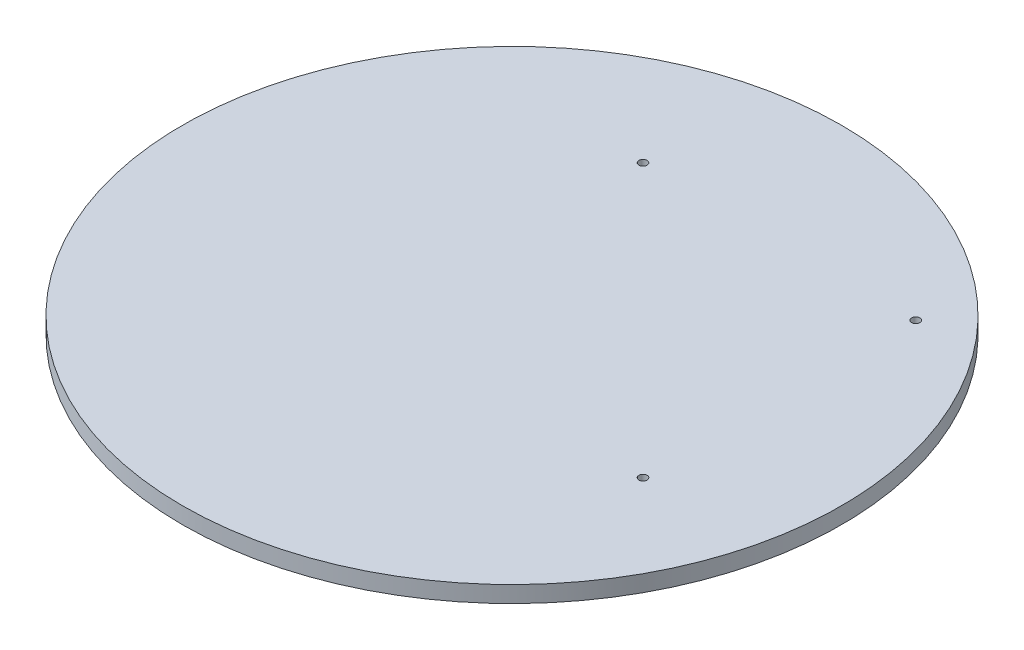
ISO-10303-21;
HEADER;
FILE_DESCRIPTION(('STEP AP214'),'2;1');
FILE_NAME('part.step','',(''),(''),'','','');
FILE_SCHEMA(('AUTOMOTIVE_DESIGN { 1 0 10303 214 1 1 1 1 }'));
ENDSEC;
DATA;
#1=APPLICATION_CONTEXT('core data for automotive mechanical design processes');
#2=APPLICATION_PROTOCOL_DEFINITION('international standard','automotive_design',2000,#1);
#3=PRODUCT_CONTEXT('',#1,'mechanical');
#4=PRODUCT('Part','Part','',(#3));
#5=PRODUCT_RELATED_PRODUCT_CATEGORY('part','',(#4));
#6=PRODUCT_DEFINITION_FORMATION('','',#4);
#7=PRODUCT_DEFINITION_CONTEXT('part definition',#1,'design');
#8=PRODUCT_DEFINITION('design','',#6,#7);
#9=PRODUCT_DEFINITION_SHAPE('','',#8);
#10=(LENGTH_UNIT() NAMED_UNIT(*) SI_UNIT(.MILLI.,.METRE.));
#11=(NAMED_UNIT(*) PLANE_ANGLE_UNIT() SI_UNIT($,.RADIAN.));
#12=(NAMED_UNIT(*) SI_UNIT($,.STERADIAN.) SOLID_ANGLE_UNIT());
#13=UNCERTAINTY_MEASURE_WITH_UNIT(LENGTH_MEASURE(1.E-05),#10,'distance_accuracy_value','');
#14=(GEOMETRIC_REPRESENTATION_CONTEXT(3) GLOBAL_UNCERTAINTY_ASSIGNED_CONTEXT((#13)) GLOBAL_UNIT_ASSIGNED_CONTEXT((#10,
#11,#12)) REPRESENTATION_CONTEXT('',''));
#15=CARTESIAN_POINT('',(0.,0.,0.));
#16=DIRECTION('',(0.,0.,1.));
#17=DIRECTION('',(1.,0.,0.));
#18=AXIS2_PLACEMENT_3D('',#15,#16,#17);
#19=CARTESIAN_POINT('',(0.,10.,0.));
#20=DIRECTION('',(0.,1.,0.));
#21=DIRECTION('',(0.,0.,1.));
#22=AXIS2_PLACEMENT_3D('',#19,#20,#21);
#23=PLANE('',#22);
#24=CARTESIAN_POINT('',(125.,10.,-120.));
#25=DIRECTION('',(0.,1.,0.));
#26=DIRECTION('',(0.,0.,1.));
#27=AXIS2_PLACEMENT_3D('',#24,#25,#26);
#28=CIRCLE('',#27,2.49999999999997);
#29=CARTESIAN_POINT('',(125.,10.,-117.5));
#30=VERTEX_POINT('',#29);
#31=EDGE_CURVE('E78',#30,#30,#28,.T.);
#32=ORIENTED_EDGE('',*,*,#31,.F.);
#33=EDGE_LOOP('',(#32));
#34=FACE_BOUND('',#33,.T.);
#35=CARTESIAN_POINT('',(0.,10.,0.));
#36=DIRECTION('',(0.,1.,0.));
#37=DIRECTION('',(0.,0.,1.));
#38=AXIS2_PLACEMENT_3D('',#35,#36,#37);
#39=CIRCLE('',#38,200.);
#40=CARTESIAN_POINT('',(0.,10.,200.));
#41=VERTEX_POINT('',#40);
#42=EDGE_CURVE('E11',#41,#41,#39,.T.);
#43=ORIENTED_EDGE('',*,*,#42,.T.);
#44=EDGE_LOOP('',(#43));
#45=FACE_BOUND('',#44,.T.);
#46=CARTESIAN_POINT('',(-40.5,10.,-120.));
#47=DIRECTION('',(0.,1.,0.));
#48=DIRECTION('',(0.,0.,1.));
#49=AXIS2_PLACEMENT_3D('',#46,#47,#48);
#50=CIRCLE('',#49,2.5);
#51=CARTESIAN_POINT('',(-40.5,10.,-117.5));
#52=VERTEX_POINT('',#51);
#53=EDGE_CURVE('E72',#52,#52,#50,.T.);
#54=ORIENTED_EDGE('',*,*,#53,.F.);
#55=EDGE_LOOP('',(#54));
#56=FACE_BOUND('',#55,.T.);
#57=CARTESIAN_POINT('',(125.,10.,45.5));
#58=DIRECTION('',(0.,1.,0.));
#59=DIRECTION('',(0.,0.,1.));
#60=AXIS2_PLACEMENT_3D('',#57,#58,#59);
#61=CIRCLE('',#60,2.5);
#62=CARTESIAN_POINT('',(125.,10.,48.));
#63=VERTEX_POINT('',#62);
#64=EDGE_CURVE('E86',#63,#63,#61,.T.);
#65=ORIENTED_EDGE('',*,*,#64,.F.);
#66=EDGE_LOOP('',(#65));
#67=FACE_BOUND('',#66,.T.);
#68=ADVANCED_FACE('F59',(#34,#45,#56,#67),#23,.T.);
#69=CARTESIAN_POINT('',(0.,0.,0.));
#70=DIRECTION('',(0.,1.,0.));
#71=DIRECTION('',(0.,0.,1.));
#72=AXIS2_PLACEMENT_3D('',#69,#70,#71);
#73=PLANE('',#72);
#74=CARTESIAN_POINT('',(0.,0.,0.));
#75=DIRECTION('',(0.,1.,0.));
#76=DIRECTION('',(0.,0.,1.));
#77=AXIS2_PLACEMENT_3D('',#74,#75,#76);
#78=CIRCLE('',#77,200.);
#79=CARTESIAN_POINT('',(0.,0.,200.));
#80=VERTEX_POINT('',#79);
#81=EDGE_CURVE('E63',#80,#80,#78,.T.);
#82=ORIENTED_EDGE('',*,*,#81,.F.);
#83=EDGE_LOOP('',(#82));
#84=FACE_BOUND('',#83,.T.);
#85=CARTESIAN_POINT('',(-40.5,0.,-120.));
#86=DIRECTION('',(0.,1.,0.));
#87=DIRECTION('',(0.,0.,1.));
#88=AXIS2_PLACEMENT_3D('',#85,#86,#87);
#89=CIRCLE('',#88,2.5);
#90=CARTESIAN_POINT('',(-40.5,0.,-117.5));
#91=VERTEX_POINT('',#90);
#92=EDGE_CURVE('E74',#91,#91,#89,.T.);
#93=ORIENTED_EDGE('',*,*,#92,.T.);
#94=EDGE_LOOP('',(#93));
#95=FACE_BOUND('',#94,.T.);
#96=CARTESIAN_POINT('',(125.,0.,-120.));
#97=DIRECTION('',(0.,1.,0.));
#98=DIRECTION('',(0.,0.,1.));
#99=AXIS2_PLACEMENT_3D('',#96,#97,#98);
#100=CIRCLE('',#99,2.49999999999997);
#101=CARTESIAN_POINT('',(125.,0.,-117.5));
#102=VERTEX_POINT('',#101);
#103=EDGE_CURVE('E82',#102,#102,#100,.T.);
#104=ORIENTED_EDGE('',*,*,#103,.T.);
#105=EDGE_LOOP('',(#104));
#106=FACE_BOUND('',#105,.T.);
#107=CARTESIAN_POINT('',(125.,0.,45.5));
#108=DIRECTION('',(0.,1.,0.));
#109=DIRECTION('',(0.,0.,1.));
#110=AXIS2_PLACEMENT_3D('',#107,#108,#109);
#111=CIRCLE('',#110,2.5);
#112=CARTESIAN_POINT('',(125.,0.,48.));
#113=VERTEX_POINT('',#112);
#114=EDGE_CURVE('E90',#113,#113,#111,.T.);
#115=ORIENTED_EDGE('',*,*,#114,.T.);
#116=EDGE_LOOP('',(#115));
#117=FACE_BOUND('',#116,.T.);
#118=ADVANCED_FACE('F102',(#84,#95,#106,#117),#73,.F.);
#119=CARTESIAN_POINT('',(0.,10.,0.));
#120=DIRECTION('',(0.,-1.,0.));
#121=DIRECTION('',(0.,0.,-1.));
#122=AXIS2_PLACEMENT_3D('',#119,#120,#121);
#123=CYLINDRICAL_SURFACE('',#122,200.);
#124=ORIENTED_EDGE('',*,*,#42,.F.);
#125=EDGE_LOOP('',(#124));
#126=FACE_BOUND('',#125,.T.);
#127=ORIENTED_EDGE('',*,*,#81,.T.);
#128=EDGE_LOOP('',(#127));
#129=FACE_BOUND('',#128,.T.);
#130=ADVANCED_FACE('F61',(#126,#129),#123,.T.);
#131=CARTESIAN_POINT('',(-40.5,10.,-120.));
#132=DIRECTION('',(0.,-1.,0.));
#133=DIRECTION('',(0.,0.,-1.));
#134=AXIS2_PLACEMENT_3D('',#131,#132,#133);
#135=CYLINDRICAL_SURFACE('',#134,2.5);
#136=ORIENTED_EDGE('',*,*,#53,.T.);
#137=EDGE_LOOP('',(#136));
#138=FACE_BOUND('',#137,.T.);
#139=ORIENTED_EDGE('',*,*,#92,.F.);
#140=EDGE_LOOP('',(#139));
#141=FACE_BOUND('',#140,.T.);
#142=ADVANCED_FACE('F111',(#138,#141),#135,.F.);
#143=CARTESIAN_POINT('',(125.,10.,-120.));
#144=DIRECTION('',(0.,-1.,0.));
#145=DIRECTION('',(0.,0.,-1.));
#146=AXIS2_PLACEMENT_3D('',#143,#144,#145);
#147=CYLINDRICAL_SURFACE('',#146,2.49999999999997);
#148=ORIENTED_EDGE('',*,*,#31,.T.);
#149=EDGE_LOOP('',(#148));
#150=FACE_BOUND('',#149,.T.);
#151=ORIENTED_EDGE('',*,*,#103,.F.);
#152=EDGE_LOOP('',(#151));
#153=FACE_BOUND('',#152,.T.);
#154=ADVANCED_FACE('F114',(#150,#153),#147,.F.);
#155=CARTESIAN_POINT('',(125.,10.,45.5));
#156=DIRECTION('',(0.,-1.,0.));
#157=DIRECTION('',(0.,0.,-1.));
#158=AXIS2_PLACEMENT_3D('',#155,#156,#157);
#159=CYLINDRICAL_SURFACE('',#158,2.5);
#160=ORIENTED_EDGE('',*,*,#64,.T.);
#161=EDGE_LOOP('',(#160));
#162=FACE_BOUND('',#161,.T.);
#163=ORIENTED_EDGE('',*,*,#114,.F.);
#164=EDGE_LOOP('',(#163));
#165=FACE_BOUND('',#164,.T.);
#166=ADVANCED_FACE('F98',(#162,#165),#159,.F.);
#167=CLOSED_SHELL('',(#68,#118,#130,#142,#154,#166));
#168=MANIFOLD_SOLID_BREP('B2',#167);
#169=ADVANCED_BREP_SHAPE_REPRESENTATION('',(#18,#168),#14);
#170=SHAPE_DEFINITION_REPRESENTATION(#9,#169);
ENDSEC;
END-ISO-10303-21;
